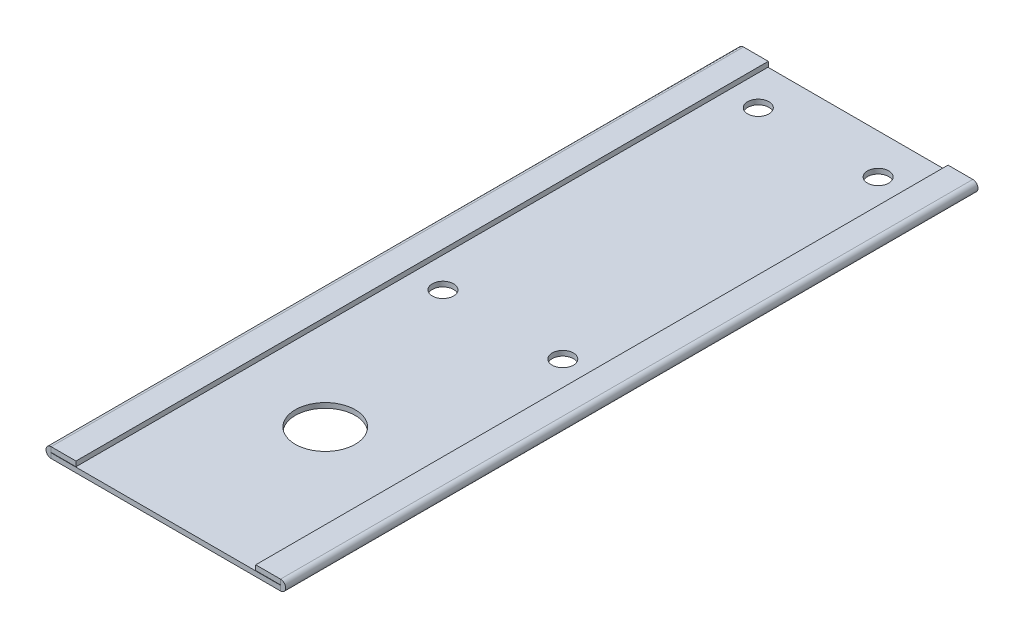
ISO-10303-21;
HEADER;
FILE_DESCRIPTION(('STEP AP214'),'2;1');
FILE_NAME('part.step','',(''),(''),'','','');
FILE_SCHEMA(('AUTOMOTIVE_DESIGN { 1 0 10303 214 1 1 1 1 }'));
ENDSEC;
DATA;
#1=APPLICATION_CONTEXT('core data for automotive mechanical design processes');
#2=APPLICATION_PROTOCOL_DEFINITION('international standard','automotive_design',2000,#1);
#3=PRODUCT_CONTEXT('',#1,'mechanical');
#4=PRODUCT('Part','Part','',(#3));
#5=PRODUCT_RELATED_PRODUCT_CATEGORY('part','',(#4));
#6=PRODUCT_DEFINITION_FORMATION('','',#4);
#7=PRODUCT_DEFINITION_CONTEXT('part definition',#1,'design');
#8=PRODUCT_DEFINITION('design','',#6,#7);
#9=PRODUCT_DEFINITION_SHAPE('','',#8);
#10=(LENGTH_UNIT() NAMED_UNIT(*) SI_UNIT(.MILLI.,.METRE.));
#11=(NAMED_UNIT(*) PLANE_ANGLE_UNIT() SI_UNIT($,.RADIAN.));
#12=(NAMED_UNIT(*) SI_UNIT($,.STERADIAN.) SOLID_ANGLE_UNIT());
#13=UNCERTAINTY_MEASURE_WITH_UNIT(LENGTH_MEASURE(1.E-05),#10,'distance_accuracy_value','');
#14=(GEOMETRIC_REPRESENTATION_CONTEXT(3) GLOBAL_UNCERTAINTY_ASSIGNED_CONTEXT((#13)) GLOBAL_UNIT_ASSIGNED_CONTEXT((#10,
#11,#12)) REPRESENTATION_CONTEXT('',''));
#15=CARTESIAN_POINT('',(0.,0.,0.));
#16=DIRECTION('',(0.,0.,1.));
#17=DIRECTION('',(1.,0.,0.));
#18=AXIS2_PLACEMENT_3D('',#15,#16,#17);
#19=CARTESIAN_POINT('',(0.,-1.5875,-220.098493));
#20=DIRECTION('',(0.,0.,-1.));
#21=DIRECTION('',(-1.,0.,0.));
#22=AXIS2_PLACEMENT_3D('',#19,#20,#21);
#23=PLANE('',#22);
#24=DIRECTION('',(-1.,0.,0.));
#25=VECTOR('',#24,1.);
#26=CARTESIAN_POINT('',(0.,0.,-220.098493));
#27=LINE('',#26,#25);
#28=CARTESIAN_POINT('',(-1.63749999999999,0.,-220.098493));
#29=VERTEX_POINT('',#28);
#30=CARTESIAN_POINT('',(-74.5625,0.,-220.098493));
#31=VERTEX_POINT('',#30);
#32=EDGE_CURVE('E280',#29,#31,#27,.T.);
#33=ORIENTED_EDGE('',*,*,#32,.F.);
#34=DIRECTION('',(0.,-1.,0.));
#35=VECTOR('',#34,1.);
#36=CARTESIAN_POINT('',(-1.63749999999999,0.,-220.098493));
#37=LINE('',#36,#35);
#38=CARTESIAN_POINT('',(-1.63749999999999,-1.5875,-220.098493));
#39=VERTEX_POINT('',#38);
#40=EDGE_CURVE('E52',#29,#39,#37,.T.);
#41=ORIENTED_EDGE('',*,*,#40,.T.);
#42=DIRECTION('',(-1.,0.,0.));
#43=VECTOR('',#42,1.);
#44=CARTESIAN_POINT('',(0.,-1.5875,-220.098493));
#45=LINE('',#44,#43);
#46=CARTESIAN_POINT('',(-74.5625,-1.5875,-220.098493));
#47=VERTEX_POINT('',#46);
#48=EDGE_CURVE('E44',#39,#47,#45,.T.);
#49=ORIENTED_EDGE('',*,*,#48,.T.);
#50=DIRECTION('',(0.,-1.,0.));
#51=VECTOR('',#50,1.);
#52=CARTESIAN_POINT('',(-74.5625,0.,-220.098493));
#53=LINE('',#52,#51);
#54=EDGE_CURVE('E213',#31,#47,#53,.T.);
#55=ORIENTED_EDGE('',*,*,#54,.F.);
#56=EDGE_LOOP('',(#33,#41,#49,#55));
#57=FACE_BOUND('',#56,.T.);
#58=ADVANCED_FACE('F36',(#57),#23,.T.);
#59=CARTESIAN_POINT('',(0.,-1.5875,0.));
#60=DIRECTION('',(0.,0.,1.));
#61=DIRECTION('',(1.,0.,0.));
#62=AXIS2_PLACEMENT_3D('',#59,#60,#61);
#63=PLANE('',#62);
#64=DIRECTION('',(0.,-1.,0.));
#65=VECTOR('',#64,1.);
#66=CARTESIAN_POINT('',(-1.63749999999999,0.,0.));
#67=LINE('',#66,#65);
#68=CARTESIAN_POINT('',(-1.63749999999999,0.,0.));
#69=VERTEX_POINT('',#68);
#70=CARTESIAN_POINT('',(-1.63749999999987,-1.5875,0.));
#71=VERTEX_POINT('',#70);
#72=EDGE_CURVE('E129',#69,#71,#67,.T.);
#73=ORIENTED_EDGE('',*,*,#72,.F.);
#74=DIRECTION('',(1.,0.,0.));
#75=VECTOR('',#74,1.);
#76=CARTESIAN_POINT('',(0.,0.,0.));
#77=LINE('',#76,#75);
#78=CARTESIAN_POINT('',(-74.5625,0.,0.));
#79=VERTEX_POINT('',#78);
#80=EDGE_CURVE('E39',#79,#69,#77,.T.);
#81=ORIENTED_EDGE('',*,*,#80,.F.);
#82=DIRECTION('',(0.,-1.,0.));
#83=VECTOR('',#82,1.);
#84=CARTESIAN_POINT('',(-74.5625,0.,0.));
#85=LINE('',#84,#83);
#86=CARTESIAN_POINT('',(-74.5625,-1.5875,0.));
#87=VERTEX_POINT('',#86);
#88=EDGE_CURVE('E131',#79,#87,#85,.T.);
#89=ORIENTED_EDGE('',*,*,#88,.T.);
#90=DIRECTION('',(1.,0.,0.));
#91=VECTOR('',#90,1.);
#92=CARTESIAN_POINT('',(0.,-1.5875,0.));
#93=LINE('',#92,#91);
#94=EDGE_CURVE('E11',#87,#71,#93,.T.);
#95=ORIENTED_EDGE('',*,*,#94,.T.);
#96=EDGE_LOOP('',(#73,#81,#89,#95));
#97=FACE_BOUND('',#96,.T.);
#98=ADVANCED_FACE('F126',(#97),#63,.T.);
#99=CARTESIAN_POINT('',(0.,-1.5875,0.));
#100=DIRECTION('',(0.,1.,0.));
#101=DIRECTION('',(0.,0.,1.));
#102=AXIS2_PLACEMENT_3D('',#99,#100,#101);
#103=PLANE('',#102);
#104=CARTESIAN_POINT('',(-38.1,-1.5875,-50.680493));
#105=DIRECTION('',(0.,1.,0.));
#106=DIRECTION('',(0.,0.,1.));
#107=AXIS2_PLACEMENT_3D('',#104,#105,#106);
#108=CIRCLE('',#107,9.525);
#109=CARTESIAN_POINT('',(-38.1,-1.5875,-41.155493));
#110=VERTEX_POINT('',#109);
#111=EDGE_CURVE('E251',#110,#110,#108,.T.);
#112=ORIENTED_EDGE('',*,*,#111,.T.);
#113=EDGE_LOOP('',(#112));
#114=FACE_BOUND('',#113,.T.);
#115=CARTESIAN_POINT('',(-57.15,-1.5875,-107.14228));
#116=DIRECTION('',(0.,1.,0.));
#117=DIRECTION('',(0.,0.,1.));
#118=AXIS2_PLACEMENT_3D('',#115,#116,#117);
#119=CIRCLE('',#118,3.3782);
#120=CARTESIAN_POINT('',(-57.15,-1.5875,-103.76408));
#121=VERTEX_POINT('',#120);
#122=EDGE_CURVE('E268',#121,#121,#119,.F.);
#123=ORIENTED_EDGE('',*,*,#122,.F.);
#124=EDGE_LOOP('',(#123));
#125=FACE_BOUND('',#124,.T.);
#126=CARTESIAN_POINT('',(-19.05,-1.5875,-107.14228));
#127=DIRECTION('',(0.,1.,0.));
#128=DIRECTION('',(0.,0.,1.));
#129=AXIS2_PLACEMENT_3D('',#126,#127,#128);
#130=CIRCLE('',#129,3.37819999999999);
#131=CARTESIAN_POINT('',(-19.05,-1.5875,-103.76408));
#132=VERTEX_POINT('',#131);
#133=EDGE_CURVE('E261',#132,#132,#130,.F.);
#134=ORIENTED_EDGE('',*,*,#133,.F.);
#135=EDGE_LOOP('',(#134));
#136=FACE_BOUND('',#135,.T.);
#137=CARTESIAN_POINT('',(-19.05,-1.5875,-207.398493));
#138=DIRECTION('',(0.,1.,0.));
#139=DIRECTION('',(0.,0.,1.));
#140=AXIS2_PLACEMENT_3D('',#137,#138,#139);
#141=CIRCLE('',#140,3.3782);
#142=CARTESIAN_POINT('',(-19.05,-1.5875,-204.020293));
#143=VERTEX_POINT('',#142);
#144=EDGE_CURVE('E260',#143,#143,#141,.F.);
#145=ORIENTED_EDGE('',*,*,#144,.F.);
#146=EDGE_LOOP('',(#145));
#147=FACE_BOUND('',#146,.T.);
#148=CARTESIAN_POINT('',(-57.15,-1.5875,-207.398493));
#149=DIRECTION('',(0.,1.,0.));
#150=DIRECTION('',(0.,0.,1.));
#151=AXIS2_PLACEMENT_3D('',#148,#149,#150);
#152=CIRCLE('',#151,3.3782);
#153=CARTESIAN_POINT('',(-57.15,-1.5875,-204.020293));
#154=VERTEX_POINT('',#153);
#155=EDGE_CURVE('E277',#154,#154,#152,.F.);
#156=ORIENTED_EDGE('',*,*,#155,.F.);
#157=EDGE_LOOP('',(#156));
#158=FACE_BOUND('',#157,.T.);
#159=ORIENTED_EDGE('',*,*,#48,.F.);
#160=DIRECTION('',(0.,0.,-1.));
#161=VECTOR('',#160,1.);
#162=CARTESIAN_POINT('',(-1.63749999999987,-1.5875,-220.098493));
#163=LINE('',#162,#161);
#164=EDGE_CURVE('E136',#39,#71,#163,.F.);
#165=ORIENTED_EDGE('',*,*,#164,.T.);
#166=ORIENTED_EDGE('',*,*,#94,.F.);
#167=DIRECTION('',(0.,0.,1.));
#168=VECTOR('',#167,1.);
#169=CARTESIAN_POINT('',(-74.5625,-1.5875,0.));
#170=LINE('',#169,#168);
#171=EDGE_CURVE('E197',#87,#47,#170,.F.);
#172=ORIENTED_EDGE('',*,*,#171,.T.);
#173=EDGE_LOOP('',(#159,#165,#166,#172));
#174=FACE_BOUND('',#173,.T.);
#175=ADVANCED_FACE('F137',(#114,#125,#136,#147,#158,#174),#103,.F.);
#176=CARTESIAN_POINT('',(0.,0.,0.));
#177=DIRECTION('',(0.,1.,0.));
#178=DIRECTION('',(0.,0.,1.));
#179=AXIS2_PLACEMENT_3D('',#176,#177,#178);
#180=PLANE('',#179);
#181=DIRECTION('',(0.,0.,-1.));
#182=VECTOR('',#181,1.);
#183=CARTESIAN_POINT('',(-1.63749999999999,0.,-220.098493));
#184=LINE('',#183,#182);
#185=EDGE_CURVE('E60',#29,#69,#184,.F.);
#186=ORIENTED_EDGE('',*,*,#185,.F.);
#187=ORIENTED_EDGE('',*,*,#32,.T.);
#188=DIRECTION('',(0.,0.,1.));
#189=VECTOR('',#188,1.);
#190=CARTESIAN_POINT('',(-74.5625,0.,0.));
#191=LINE('',#190,#189);
#192=EDGE_CURVE('E208',#79,#31,#191,.F.);
#193=ORIENTED_EDGE('',*,*,#192,.F.);
#194=ORIENTED_EDGE('',*,*,#80,.T.);
#195=EDGE_LOOP('',(#186,#187,#193,#194));
#196=FACE_BOUND('',#195,.T.);
#197=CARTESIAN_POINT('',(-38.1,0.,-50.680493));
#198=DIRECTION('',(0.,1.,0.));
#199=DIRECTION('',(0.,0.,1.));
#200=AXIS2_PLACEMENT_3D('',#197,#198,#199);
#201=CIRCLE('',#200,9.525);
#202=CARTESIAN_POINT('',(-38.1,0.,-41.155493));
#203=VERTEX_POINT('',#202);
#204=EDGE_CURVE('E249',#203,#203,#201,.T.);
#205=ORIENTED_EDGE('',*,*,#204,.F.);
#206=EDGE_LOOP('',(#205));
#207=FACE_BOUND('',#206,.T.);
#208=CARTESIAN_POINT('',(-57.15,0.,-107.14228));
#209=DIRECTION('',(0.,1.,0.));
#210=DIRECTION('',(0.,0.,1.));
#211=AXIS2_PLACEMENT_3D('',#208,#209,#210);
#212=CIRCLE('',#211,3.3782);
#213=CARTESIAN_POINT('',(-57.15,0.,-103.76408));
#214=VERTEX_POINT('',#213);
#215=EDGE_CURVE('E254',#214,#214,#212,.T.);
#216=ORIENTED_EDGE('',*,*,#215,.F.);
#217=EDGE_LOOP('',(#216));
#218=FACE_BOUND('',#217,.T.);
#219=CARTESIAN_POINT('',(-19.05,0.,-107.14228));
#220=DIRECTION('',(0.,1.,0.));
#221=DIRECTION('',(0.,0.,1.));
#222=AXIS2_PLACEMENT_3D('',#219,#220,#221);
#223=CIRCLE('',#222,3.37819999999999);
#224=CARTESIAN_POINT('',(-19.05,0.,-103.76408));
#225=VERTEX_POINT('',#224);
#226=EDGE_CURVE('E265',#225,#225,#223,.T.);
#227=ORIENTED_EDGE('',*,*,#226,.F.);
#228=EDGE_LOOP('',(#227));
#229=FACE_BOUND('',#228,.T.);
#230=CARTESIAN_POINT('',(-19.05,0.,-207.398493));
#231=DIRECTION('',(0.,1.,0.));
#232=DIRECTION('',(0.,0.,1.));
#233=AXIS2_PLACEMENT_3D('',#230,#231,#232);
#234=CIRCLE('',#233,3.3782);
#235=CARTESIAN_POINT('',(-19.05,0.,-204.020293));
#236=VERTEX_POINT('',#235);
#237=EDGE_CURVE('E257',#236,#236,#234,.T.);
#238=ORIENTED_EDGE('',*,*,#237,.F.);
#239=EDGE_LOOP('',(#238));
#240=FACE_BOUND('',#239,.T.);
#241=CARTESIAN_POINT('',(-57.15,0.,-207.398493));
#242=DIRECTION('',(0.,1.,0.));
#243=DIRECTION('',(0.,0.,1.));
#244=AXIS2_PLACEMENT_3D('',#241,#242,#243);
#245=CIRCLE('',#244,3.3782);
#246=CARTESIAN_POINT('',(-57.15,0.,-204.020293));
#247=VERTEX_POINT('',#246);
#248=EDGE_CURVE('E264',#247,#247,#245,.T.);
#249=ORIENTED_EDGE('',*,*,#248,.F.);
#250=EDGE_LOOP('',(#249));
#251=FACE_BOUND('',#250,.T.);
#252=ADVANCED_FACE('F282',(#196,#207,#218,#229,#240,#251),#180,.T.);
#253=CARTESIAN_POINT('',(-57.15,-1.5885,-207.398493));
#254=DIRECTION('',(0.,1.,0.));
#255=DIRECTION('',(0.,0.,1.));
#256=AXIS2_PLACEMENT_3D('',#253,#254,#255);
#257=CYLINDRICAL_SURFACE('',#256,3.3782);
#258=ORIENTED_EDGE('',*,*,#248,.T.);
#259=EDGE_LOOP('',(#258));
#260=FACE_BOUND('',#259,.T.);
#261=ORIENTED_EDGE('',*,*,#155,.T.);
#262=EDGE_LOOP('',(#261));
#263=FACE_BOUND('',#262,.T.);
#264=ADVANCED_FACE('F562',(#260,#263),#257,.F.);
#265=CARTESIAN_POINT('',(-19.05,-1.5885,-207.398493));
#266=DIRECTION('',(0.,1.,0.));
#267=DIRECTION('',(0.,0.,1.));
#268=AXIS2_PLACEMENT_3D('',#265,#266,#267);
#269=CYLINDRICAL_SURFACE('',#268,3.3782);
#270=ORIENTED_EDGE('',*,*,#237,.T.);
#271=EDGE_LOOP('',(#270));
#272=FACE_BOUND('',#271,.T.);
#273=ORIENTED_EDGE('',*,*,#144,.T.);
#274=EDGE_LOOP('',(#273));
#275=FACE_BOUND('',#274,.T.);
#276=ADVANCED_FACE('F552',(#272,#275),#269,.F.);
#277=CARTESIAN_POINT('',(-19.05,-1.5885,-107.14228));
#278=DIRECTION('',(0.,1.,0.));
#279=DIRECTION('',(0.,0.,1.));
#280=AXIS2_PLACEMENT_3D('',#277,#278,#279);
#281=CYLINDRICAL_SURFACE('',#280,3.37819999999999);
#282=ORIENTED_EDGE('',*,*,#226,.T.);
#283=EDGE_LOOP('',(#282));
#284=FACE_BOUND('',#283,.T.);
#285=ORIENTED_EDGE('',*,*,#133,.T.);
#286=EDGE_LOOP('',(#285));
#287=FACE_BOUND('',#286,.T.);
#288=ADVANCED_FACE('F542',(#284,#287),#281,.F.);
#289=CARTESIAN_POINT('',(-57.15,-1.5885,-107.14228));
#290=DIRECTION('',(0.,1.,0.));
#291=DIRECTION('',(0.,0.,1.));
#292=AXIS2_PLACEMENT_3D('',#289,#290,#291);
#293=CYLINDRICAL_SURFACE('',#292,3.3782);
#294=ORIENTED_EDGE('',*,*,#215,.T.);
#295=EDGE_LOOP('',(#294));
#296=FACE_BOUND('',#295,.T.);
#297=ORIENTED_EDGE('',*,*,#122,.T.);
#298=EDGE_LOOP('',(#297));
#299=FACE_BOUND('',#298,.T.);
#300=ADVANCED_FACE('F533',(#296,#299),#293,.F.);
#301=CARTESIAN_POINT('',(-38.1,-1.5875,-50.680493));
#302=DIRECTION('',(0.,1.,0.));
#303=DIRECTION('',(0.,0.,1.));
#304=AXIS2_PLACEMENT_3D('',#301,#302,#303);
#305=CYLINDRICAL_SURFACE('',#304,9.525);
#306=ORIENTED_EDGE('',*,*,#111,.F.);
#307=EDGE_LOOP('',(#306));
#308=FACE_BOUND('',#307,.T.);
#309=ORIENTED_EDGE('',*,*,#204,.T.);
#310=EDGE_LOOP('',(#309));
#311=FACE_BOUND('',#310,.T.);
#312=ADVANCED_FACE('F320',(#308,#311),#305,.F.);
#313=CARTESIAN_POINT('',(-70.61875,1.6875,0.));
#314=DIRECTION('',(0.,0.,-1.));
#315=DIRECTION('',(-1.,0.,0.));
#316=AXIS2_PLACEMENT_3D('',#313,#314,#315);
#317=PLANE('',#316);
#318=DIRECTION('',(0.,1.,0.));
#319=VECTOR('',#318,1.);
#320=CARTESIAN_POINT('',(-74.5625,1.6875,0.));
#321=LINE('',#320,#319);
#322=CARTESIAN_POINT('',(-74.5625,0.1,0.));
#323=VERTEX_POINT('',#322);
#324=CARTESIAN_POINT('',(-74.5625,1.6875,0.));
#325=VERTEX_POINT('',#324);
#326=EDGE_CURVE('E243',#323,#325,#321,.T.);
#327=ORIENTED_EDGE('',*,*,#326,.F.);
#328=DIRECTION('',(1.,0.,0.));
#329=VECTOR('',#328,1.);
#330=CARTESIAN_POINT('',(-70.61875,0.1,0.));
#331=LINE('',#330,#329);
#332=CARTESIAN_POINT('',(-66.675,0.1,0.));
#333=VERTEX_POINT('',#332);
#334=EDGE_CURVE('E234',#333,#323,#331,.F.);
#335=ORIENTED_EDGE('',*,*,#334,.F.);
#336=DIRECTION('',(0.,1.,0.));
#337=VECTOR('',#336,1.);
#338=CARTESIAN_POINT('',(-66.675,1.6875,0.));
#339=LINE('',#338,#337);
#340=CARTESIAN_POINT('',(-66.675,1.6875,0.));
#341=VERTEX_POINT('',#340);
#342=EDGE_CURVE('E241',#333,#341,#339,.T.);
#343=ORIENTED_EDGE('',*,*,#342,.T.);
#344=DIRECTION('',(-1.,0.,0.));
#345=VECTOR('',#344,1.);
#346=CARTESIAN_POINT('',(-70.61875,1.6875,0.));
#347=LINE('',#346,#345);
#348=EDGE_CURVE('E222',#341,#325,#347,.T.);
#349=ORIENTED_EDGE('',*,*,#348,.T.);
#350=EDGE_LOOP('',(#327,#335,#343,#349));
#351=FACE_BOUND('',#350,.T.);
#352=ADVANCED_FACE('F310',(#351),#317,.F.);
#353=CARTESIAN_POINT('',(-66.675,1.6875,-110.0492465));
#354=DIRECTION('',(-1.,0.,0.));
#355=DIRECTION('',(0.,0.,1.));
#356=AXIS2_PLACEMENT_3D('',#353,#354,#355);
#357=PLANE('',#356);
#358=ORIENTED_EDGE('',*,*,#342,.F.);
#359=DIRECTION('',(0.,0.,1.));
#360=VECTOR('',#359,1.);
#361=CARTESIAN_POINT('',(-66.675,0.1,-110.0492465));
#362=LINE('',#361,#360);
#363=CARTESIAN_POINT('',(-66.675,0.1,-220.098493));
#364=VERTEX_POINT('',#363);
#365=EDGE_CURVE('E231',#364,#333,#362,.T.);
#366=ORIENTED_EDGE('',*,*,#365,.F.);
#367=DIRECTION('',(0.,1.,0.));
#368=VECTOR('',#367,1.);
#369=CARTESIAN_POINT('',(-66.675,1.6875,-220.098493));
#370=LINE('',#369,#368);
#371=CARTESIAN_POINT('',(-66.675,1.6875,-220.098493));
#372=VERTEX_POINT('',#371);
#373=EDGE_CURVE('E221',#364,#372,#370,.T.);
#374=ORIENTED_EDGE('',*,*,#373,.T.);
#375=DIRECTION('',(0.,0.,1.));
#376=VECTOR('',#375,1.);
#377=CARTESIAN_POINT('',(-66.675,1.6875,-110.0492465));
#378=LINE('',#377,#376);
#379=EDGE_CURVE('E218',#372,#341,#378,.T.);
#380=ORIENTED_EDGE('',*,*,#379,.T.);
#381=EDGE_LOOP('',(#358,#366,#374,#380));
#382=FACE_BOUND('',#381,.T.);
#383=ADVANCED_FACE('F312',(#382),#357,.F.);
#384=CARTESIAN_POINT('',(-70.61875,1.6875,-220.098493));
#385=DIRECTION('',(0.,0.,1.));
#386=DIRECTION('',(1.,0.,0.));
#387=AXIS2_PLACEMENT_3D('',#384,#385,#386);
#388=PLANE('',#387);
#389=DIRECTION('',(1.,0.,0.));
#390=VECTOR('',#389,1.);
#391=CARTESIAN_POINT('',(-70.61875,0.1,-220.098493));
#392=LINE('',#391,#390);
#393=CARTESIAN_POINT('',(-74.5625,0.1,-220.098493));
#394=VERTEX_POINT('',#393);
#395=EDGE_CURVE('E216',#394,#364,#392,.T.);
#396=ORIENTED_EDGE('',*,*,#395,.F.);
#397=DIRECTION('',(0.,1.,0.));
#398=VECTOR('',#397,1.);
#399=CARTESIAN_POINT('',(-74.5625,1.6875,-220.098493));
#400=LINE('',#399,#398);
#401=CARTESIAN_POINT('',(-74.5625,1.6875,-220.098493));
#402=VERTEX_POINT('',#401);
#403=EDGE_CURVE('E246',#394,#402,#400,.T.);
#404=ORIENTED_EDGE('',*,*,#403,.T.);
#405=DIRECTION('',(1.,0.,0.));
#406=VECTOR('',#405,1.);
#407=CARTESIAN_POINT('',(-70.61875,1.6875,-220.098493));
#408=LINE('',#407,#406);
#409=EDGE_CURVE('E228',#402,#372,#408,.T.);
#410=ORIENTED_EDGE('',*,*,#409,.T.);
#411=ORIENTED_EDGE('',*,*,#373,.F.);
#412=EDGE_LOOP('',(#396,#404,#410,#411));
#413=FACE_BOUND('',#412,.T.);
#414=ADVANCED_FACE('F299',(#413),#388,.F.);
#415=CARTESIAN_POINT('',(-70.61875,1.6875,-110.0492465));
#416=DIRECTION('',(0.,1.,0.));
#417=DIRECTION('',(0.,0.,1.));
#418=AXIS2_PLACEMENT_3D('',#415,#416,#417);
#419=PLANE('',#418);
#420=ORIENTED_EDGE('',*,*,#379,.F.);
#421=ORIENTED_EDGE('',*,*,#409,.F.);
#422=DIRECTION('',(0.,0.,-1.));
#423=VECTOR('',#422,1.);
#424=CARTESIAN_POINT('',(-74.5625,1.6875,-110.0492465));
#425=LINE('',#424,#423);
#426=EDGE_CURVE('E225',#325,#402,#425,.T.);
#427=ORIENTED_EDGE('',*,*,#426,.F.);
#428=ORIENTED_EDGE('',*,*,#348,.F.);
#429=EDGE_LOOP('',(#420,#421,#427,#428));
#430=FACE_BOUND('',#429,.T.);
#431=ADVANCED_FACE('F308',(#430),#419,.T.);
#432=CARTESIAN_POINT('',(-70.61875,0.1,-110.0492465));
#433=DIRECTION('',(0.,1.,0.));
#434=DIRECTION('',(0.,0.,1.));
#435=AXIS2_PLACEMENT_3D('',#432,#433,#434);
#436=PLANE('',#435);
#437=ORIENTED_EDGE('',*,*,#365,.T.);
#438=ORIENTED_EDGE('',*,*,#334,.T.);
#439=DIRECTION('',(0.,0.,1.));
#440=VECTOR('',#439,1.);
#441=CARTESIAN_POINT('',(-74.5625,0.1,-110.0492465));
#442=LINE('',#441,#440);
#443=EDGE_CURVE('E237',#323,#394,#442,.F.);
#444=ORIENTED_EDGE('',*,*,#443,.T.);
#445=ORIENTED_EDGE('',*,*,#395,.T.);
#446=EDGE_LOOP('',(#437,#438,#444,#445));
#447=FACE_BOUND('',#446,.T.);
#448=ADVANCED_FACE('F294',(#447),#436,.F.);
#449=CARTESIAN_POINT('',(-74.5625,0.05,-220.098493));
#450=DIRECTION('',(0.,0.,-1.));
#451=DIRECTION('',(-1.,0.,0.));
#452=AXIS2_PLACEMENT_3D('',#449,#450,#451);
#453=PLANE('',#452);
#454=ORIENTED_EDGE('',*,*,#403,.F.);
#455=CARTESIAN_POINT('',(-74.5625,0.05,-220.098493));
#456=DIRECTION('',(0.,0.,1.));
#457=DIRECTION('',(1.,0.,0.));
#458=AXIS2_PLACEMENT_3D('',#455,#456,#457);
#459=CIRCLE('',#458,0.05);
#460=EDGE_CURVE('E205',#31,#394,#459,.F.);
#461=ORIENTED_EDGE('',*,*,#460,.F.);
#462=ORIENTED_EDGE('',*,*,#54,.T.);
#463=CARTESIAN_POINT('',(-74.5625,0.05,-220.098493));
#464=DIRECTION('',(0.,0.,1.));
#465=DIRECTION('',(1.,0.,0.));
#466=AXIS2_PLACEMENT_3D('',#463,#464,#465);
#467=CIRCLE('',#466,1.6375);
#468=EDGE_CURVE('E199',#47,#402,#467,.F.);
#469=ORIENTED_EDGE('',*,*,#468,.T.);
#470=EDGE_LOOP('',(#454,#461,#462,#469));
#471=FACE_BOUND('',#470,.T.);
#472=ADVANCED_FACE('F301',(#471),#453,.T.);
#473=CARTESIAN_POINT('',(-74.5625,0.05,0.));
#474=DIRECTION('',(0.,0.,-1.));
#475=DIRECTION('',(-1.,0.,0.));
#476=AXIS2_PLACEMENT_3D('',#473,#474,#475);
#477=PLANE('',#476);
#478=CARTESIAN_POINT('',(-74.5625,0.05,0.));
#479=DIRECTION('',(0.,0.,1.));
#480=DIRECTION('',(1.,0.,0.));
#481=AXIS2_PLACEMENT_3D('',#478,#479,#480);
#482=CIRCLE('',#481,0.05);
#483=EDGE_CURVE('E195',#323,#79,#482,.T.);
#484=ORIENTED_EDGE('',*,*,#483,.F.);
#485=ORIENTED_EDGE('',*,*,#326,.T.);
#486=CARTESIAN_POINT('',(-74.5625,0.05,0.));
#487=DIRECTION('',(0.,0.,1.));
#488=DIRECTION('',(1.,0.,0.));
#489=AXIS2_PLACEMENT_3D('',#486,#487,#488);
#490=CIRCLE('',#489,1.6375);
#491=EDGE_CURVE('E200',#325,#87,#490,.T.);
#492=ORIENTED_EDGE('',*,*,#491,.T.);
#493=ORIENTED_EDGE('',*,*,#88,.F.);
#494=EDGE_LOOP('',(#484,#485,#492,#493));
#495=FACE_BOUND('',#494,.T.);
#496=ADVANCED_FACE('F286',(#495),#477,.F.);
#497=CARTESIAN_POINT('',(-74.5625,0.05,0.));
#498=DIRECTION('',(0.,0.,1.));
#499=DIRECTION('',(0.,1.,0.));
#500=AXIS2_PLACEMENT_3D('',#497,#498,#499);
#501=CYLINDRICAL_SURFACE('',#500,1.6375);
#502=ORIENTED_EDGE('',*,*,#171,.F.);
#503=ORIENTED_EDGE('',*,*,#491,.F.);
#504=ORIENTED_EDGE('',*,*,#426,.T.);
#505=ORIENTED_EDGE('',*,*,#468,.F.);
#506=EDGE_LOOP('',(#502,#503,#504,#505));
#507=FACE_BOUND('',#506,.T.);
#508=ADVANCED_FACE('F304',(#507),#501,.T.);
#509=CARTESIAN_POINT('',(-74.5625,0.05,0.));
#510=DIRECTION('',(0.,0.,1.));
#511=DIRECTION('',(0.,1.,0.));
#512=AXIS2_PLACEMENT_3D('',#509,#510,#511);
#513=CYLINDRICAL_SURFACE('',#512,0.05);
#514=ORIENTED_EDGE('',*,*,#192,.T.);
#515=ORIENTED_EDGE('',*,*,#460,.T.);
#516=ORIENTED_EDGE('',*,*,#443,.F.);
#517=ORIENTED_EDGE('',*,*,#483,.T.);
#518=EDGE_LOOP('',(#514,#515,#516,#517));
#519=FACE_BOUND('',#518,.T.);
#520=ADVANCED_FACE('F290',(#519),#513,.F.);
#521=CARTESIAN_POINT('',(-5.58124999999999,1.6875,-220.098493));
#522=DIRECTION('',(0.,0.,1.));
#523=DIRECTION('',(1.,0.,0.));
#524=AXIS2_PLACEMENT_3D('',#521,#522,#523);
#525=PLANE('',#524);
#526=DIRECTION('',(0.,1.,0.));
#527=VECTOR('',#526,1.);
#528=CARTESIAN_POINT('',(-1.63749999999999,1.6875,-220.098493));
#529=LINE('',#528,#527);
#530=CARTESIAN_POINT('',(-1.63749999999999,0.1,-220.098493));
#531=VERTEX_POINT('',#530);
#532=CARTESIAN_POINT('',(-1.63749999999999,1.6875,-220.098493));
#533=VERTEX_POINT('',#532);
#534=EDGE_CURVE('E189',#531,#533,#529,.T.);
#535=ORIENTED_EDGE('',*,*,#534,.F.);
#536=DIRECTION('',(1.,0.,0.));
#537=VECTOR('',#536,1.);
#538=CARTESIAN_POINT('',(-5.58124999999999,0.1,-220.098493));
#539=LINE('',#538,#537);
#540=CARTESIAN_POINT('',(-9.52499999999999,0.1,-220.098493));
#541=VERTEX_POINT('',#540);
#542=EDGE_CURVE('E180',#541,#531,#539,.T.);
#543=ORIENTED_EDGE('',*,*,#542,.F.);
#544=DIRECTION('',(0.,1.,0.));
#545=VECTOR('',#544,1.);
#546=CARTESIAN_POINT('',(-9.52499999999999,1.6875,-220.098493));
#547=LINE('',#546,#545);
#548=CARTESIAN_POINT('',(-9.52499999999999,1.6875,-220.098493));
#549=VERTEX_POINT('',#548);
#550=EDGE_CURVE('E187',#541,#549,#547,.T.);
#551=ORIENTED_EDGE('',*,*,#550,.T.);
#552=DIRECTION('',(1.,0.,0.));
#553=VECTOR('',#552,1.);
#554=CARTESIAN_POINT('',(-5.58124999999999,1.6875,-220.098493));
#555=LINE('',#554,#553);
#556=EDGE_CURVE('E170',#549,#533,#555,.T.);
#557=ORIENTED_EDGE('',*,*,#556,.T.);
#558=EDGE_LOOP('',(#535,#543,#551,#557));
#559=FACE_BOUND('',#558,.T.);
#560=ADVANCED_FACE('F345',(#559),#525,.F.);
#561=CARTESIAN_POINT('',(-9.52499999999999,1.6875,-110.0492465));
#562=DIRECTION('',(1.,0.,0.));
#563=DIRECTION('',(0.,0.,-1.));
#564=AXIS2_PLACEMENT_3D('',#561,#562,#563);
#565=PLANE('',#564);
#566=ORIENTED_EDGE('',*,*,#550,.F.);
#567=DIRECTION('',(0.,0.,1.));
#568=VECTOR('',#567,1.);
#569=CARTESIAN_POINT('',(-9.525,0.1,-110.0492465));
#570=LINE('',#569,#568);
#571=CARTESIAN_POINT('',(-9.525,0.1,0.));
#572=VERTEX_POINT('',#571);
#573=EDGE_CURVE('E177',#572,#541,#570,.F.);
#574=ORIENTED_EDGE('',*,*,#573,.F.);
#575=DIRECTION('',(0.,1.,0.));
#576=VECTOR('',#575,1.);
#577=CARTESIAN_POINT('',(-9.525,1.6875,0.));
#578=LINE('',#577,#576);
#579=CARTESIAN_POINT('',(-9.525,1.6875,0.));
#580=VERTEX_POINT('',#579);
#581=EDGE_CURVE('E169',#572,#580,#578,.T.);
#582=ORIENTED_EDGE('',*,*,#581,.T.);
#583=DIRECTION('',(0.,0.,-1.));
#584=VECTOR('',#583,1.);
#585=CARTESIAN_POINT('',(-9.52499999999999,1.6875,-110.0492465));
#586=LINE('',#585,#584);
#587=EDGE_CURVE('E166',#580,#549,#586,.T.);
#588=ORIENTED_EDGE('',*,*,#587,.T.);
#589=EDGE_LOOP('',(#566,#574,#582,#588));
#590=FACE_BOUND('',#589,.T.);
#591=ADVANCED_FACE('F342',(#590),#565,.F.);
#592=CARTESIAN_POINT('',(-5.58125,1.6875,0.));
#593=DIRECTION('',(0.,0.,-1.));
#594=DIRECTION('',(-1.,0.,0.));
#595=AXIS2_PLACEMENT_3D('',#592,#593,#594);
#596=PLANE('',#595);
#597=DIRECTION('',(1.,0.,0.));
#598=VECTOR('',#597,1.);
#599=CARTESIAN_POINT('',(-5.58124999999999,0.1,0.));
#600=LINE('',#599,#598);
#601=CARTESIAN_POINT('',(-1.6375,0.1,0.));
#602=VERTEX_POINT('',#601);
#603=EDGE_CURVE('E152',#602,#572,#600,.F.);
#604=ORIENTED_EDGE('',*,*,#603,.F.);
#605=DIRECTION('',(0.,1.,0.));
#606=VECTOR('',#605,1.);
#607=CARTESIAN_POINT('',(-1.6375,1.6875,0.));
#608=LINE('',#607,#606);
#609=CARTESIAN_POINT('',(-1.63749999999999,1.6875,0.));
#610=VERTEX_POINT('',#609);
#611=EDGE_CURVE('E192',#602,#610,#608,.T.);
#612=ORIENTED_EDGE('',*,*,#611,.T.);
#613=DIRECTION('',(-1.,0.,0.));
#614=VECTOR('',#613,1.);
#615=CARTESIAN_POINT('',(-5.58125,1.6875,0.));
#616=LINE('',#615,#614);
#617=EDGE_CURVE('E174',#610,#580,#616,.T.);
#618=ORIENTED_EDGE('',*,*,#617,.T.);
#619=ORIENTED_EDGE('',*,*,#581,.F.);
#620=EDGE_LOOP('',(#604,#612,#618,#619));
#621=FACE_BOUND('',#620,.T.);
#622=ADVANCED_FACE('F339',(#621),#596,.F.);
#623=CARTESIAN_POINT('',(-5.58124999999999,1.6875,-110.0492465));
#624=DIRECTION('',(0.,1.,0.));
#625=DIRECTION('',(0.,0.,1.));
#626=AXIS2_PLACEMENT_3D('',#623,#624,#625);
#627=PLANE('',#626);
#628=ORIENTED_EDGE('',*,*,#587,.F.);
#629=ORIENTED_EDGE('',*,*,#617,.F.);
#630=DIRECTION('',(0.,0.,1.));
#631=VECTOR('',#630,1.);
#632=CARTESIAN_POINT('',(-1.63749999999999,1.6875,-110.0492465));
#633=LINE('',#632,#631);
#634=EDGE_CURVE('E156',#533,#610,#633,.T.);
#635=ORIENTED_EDGE('',*,*,#634,.F.);
#636=ORIENTED_EDGE('',*,*,#556,.F.);
#637=EDGE_LOOP('',(#628,#629,#635,#636));
#638=FACE_BOUND('',#637,.T.);
#639=ADVANCED_FACE('F347',(#638),#627,.T.);
#640=CARTESIAN_POINT('',(-5.58124999999999,0.1,-110.0492465));
#641=DIRECTION('',(0.,1.,0.));
#642=DIRECTION('',(0.,0.,1.));
#643=AXIS2_PLACEMENT_3D('',#640,#641,#642);
#644=PLANE('',#643);
#645=ORIENTED_EDGE('',*,*,#573,.T.);
#646=ORIENTED_EDGE('',*,*,#542,.T.);
#647=DIRECTION('',(0.,0.,1.));
#648=VECTOR('',#647,1.);
#649=CARTESIAN_POINT('',(-1.63749999999999,0.1,-110.0492465));
#650=LINE('',#649,#648);
#651=EDGE_CURVE('E183',#531,#602,#650,.T.);
#652=ORIENTED_EDGE('',*,*,#651,.T.);
#653=ORIENTED_EDGE('',*,*,#603,.T.);
#654=EDGE_LOOP('',(#645,#646,#652,#653));
#655=FACE_BOUND('',#654,.T.);
#656=ADVANCED_FACE('F335',(#655),#644,.F.);
#657=CARTESIAN_POINT('',(-1.63749999999999,0.05,0.));
#658=DIRECTION('',(0.,0.,1.));
#659=DIRECTION('',(1.,0.,0.));
#660=AXIS2_PLACEMENT_3D('',#657,#658,#659);
#661=PLANE('',#660);
#662=ORIENTED_EDGE('',*,*,#611,.F.);
#663=CARTESIAN_POINT('',(-1.63749999999999,0.05,0.));
#664=DIRECTION('',(0.,0.,-1.));
#665=DIRECTION('',(-1.,0.,0.));
#666=AXIS2_PLACEMENT_3D('',#663,#664,#665);
#667=CIRCLE('',#666,0.05);
#668=EDGE_CURVE('E151',#69,#602,#667,.F.);
#669=ORIENTED_EDGE('',*,*,#668,.F.);
#670=ORIENTED_EDGE('',*,*,#72,.T.);
#671=CARTESIAN_POINT('',(-1.63749999999999,0.05,0.));
#672=DIRECTION('',(0.,0.,-1.));
#673=DIRECTION('',(-1.,0.,0.));
#674=AXIS2_PLACEMENT_3D('',#671,#672,#673);
#675=CIRCLE('',#674,1.6375);
#676=EDGE_CURVE('E142',#71,#610,#675,.F.);
#677=ORIENTED_EDGE('',*,*,#676,.T.);
#678=EDGE_LOOP('',(#662,#669,#670,#677));
#679=FACE_BOUND('',#678,.T.);
#680=ADVANCED_FACE('F149',(#679),#661,.T.);
#681=CARTESIAN_POINT('',(-1.63749999999999,0.05,-220.098493));
#682=DIRECTION('',(0.,0.,1.));
#683=DIRECTION('',(1.,0.,0.));
#684=AXIS2_PLACEMENT_3D('',#681,#682,#683);
#685=PLANE('',#684);
#686=CARTESIAN_POINT('',(-1.63749999999999,0.05,-220.098493));
#687=DIRECTION('',(0.,0.,-1.));
#688=DIRECTION('',(-1.,0.,0.));
#689=AXIS2_PLACEMENT_3D('',#686,#687,#688);
#690=CIRCLE('',#689,0.05);
#691=EDGE_CURVE('E163',#531,#29,#690,.T.);
#692=ORIENTED_EDGE('',*,*,#691,.F.);
#693=ORIENTED_EDGE('',*,*,#534,.T.);
#694=CARTESIAN_POINT('',(-1.63749999999999,0.05,-220.098493));
#695=DIRECTION('',(0.,0.,-1.));
#696=DIRECTION('',(-1.,0.,0.));
#697=AXIS2_PLACEMENT_3D('',#694,#695,#696);
#698=CIRCLE('',#697,1.6375);
#699=EDGE_CURVE('E143',#533,#39,#698,.T.);
#700=ORIENTED_EDGE('',*,*,#699,.T.);
#701=ORIENTED_EDGE('',*,*,#40,.F.);
#702=EDGE_LOOP('',(#692,#693,#700,#701));
#703=FACE_BOUND('',#702,.T.);
#704=ADVANCED_FACE('F329',(#703),#685,.F.);
#705=CARTESIAN_POINT('',(-1.63749999999999,0.05,-220.098493));
#706=DIRECTION('',(0.,0.,-1.));
#707=DIRECTION('',(0.,1.,0.));
#708=AXIS2_PLACEMENT_3D('',#705,#706,#707);
#709=CYLINDRICAL_SURFACE('',#708,1.6375);
#710=ORIENTED_EDGE('',*,*,#164,.F.);
#711=ORIENTED_EDGE('',*,*,#699,.F.);
#712=ORIENTED_EDGE('',*,*,#634,.T.);
#713=ORIENTED_EDGE('',*,*,#676,.F.);
#714=EDGE_LOOP('',(#710,#711,#712,#713));
#715=FACE_BOUND('',#714,.T.);
#716=ADVANCED_FACE('F155',(#715),#709,.T.);
#717=CARTESIAN_POINT('',(-1.63749999999999,0.05,-220.098493));
#718=DIRECTION('',(0.,0.,-1.));
#719=DIRECTION('',(0.,1.,0.));
#720=AXIS2_PLACEMENT_3D('',#717,#718,#719);
#721=CYLINDRICAL_SURFACE('',#720,0.05);
#722=ORIENTED_EDGE('',*,*,#185,.T.);
#723=ORIENTED_EDGE('',*,*,#668,.T.);
#724=ORIENTED_EDGE('',*,*,#651,.F.);
#725=ORIENTED_EDGE('',*,*,#691,.T.);
#726=EDGE_LOOP('',(#722,#723,#724,#725));
#727=FACE_BOUND('',#726,.T.);
#728=ADVANCED_FACE('F332',(#727),#721,.F.);
#729=CLOSED_SHELL('',(#58,#98,#175,#252,#264,#276,#288,#300,#312,#352,#383,#414,#431,#448,#472,
#496,#508,#520,#560,#591,#622,#639,#656,#680,#704,#716,#728));
#730=MANIFOLD_SOLID_BREP('B2',#729);
#731=ADVANCED_BREP_SHAPE_REPRESENTATION('',(#18,#730),#14);
#732=SHAPE_DEFINITION_REPRESENTATION(#9,#731);
ENDSEC;
END-ISO-10303-21;
